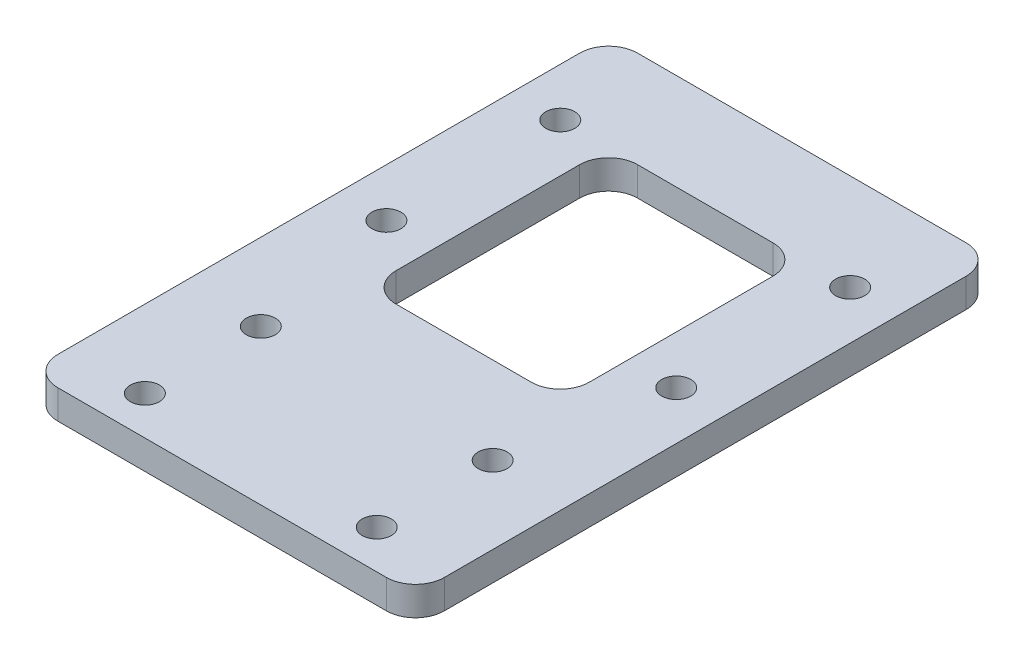
ISO-10303-21;
HEADER;
FILE_DESCRIPTION(('STEP AP214'),'2;1');
FILE_NAME('part.step','',(''),(''),'','','');
FILE_SCHEMA(('AUTOMOTIVE_DESIGN { 1 0 10303 214 1 1 1 1 }'));
ENDSEC;
DATA;
#1=APPLICATION_CONTEXT('core data for automotive mechanical design processes');
#2=APPLICATION_PROTOCOL_DEFINITION('international standard','automotive_design',2000,#1);
#3=PRODUCT_CONTEXT('',#1,'mechanical');
#4=PRODUCT('Part','Part','',(#3));
#5=PRODUCT_RELATED_PRODUCT_CATEGORY('part','',(#4));
#6=PRODUCT_DEFINITION_FORMATION('','',#4);
#7=PRODUCT_DEFINITION_CONTEXT('part definition',#1,'design');
#8=PRODUCT_DEFINITION('design','',#6,#7);
#9=PRODUCT_DEFINITION_SHAPE('','',#8);
#10=(LENGTH_UNIT() NAMED_UNIT(*) SI_UNIT(.MILLI.,.METRE.));
#11=(NAMED_UNIT(*) PLANE_ANGLE_UNIT() SI_UNIT($,.RADIAN.));
#12=(NAMED_UNIT(*) SI_UNIT($,.STERADIAN.) SOLID_ANGLE_UNIT());
#13=UNCERTAINTY_MEASURE_WITH_UNIT(LENGTH_MEASURE(1.E-05),#10,'distance_accuracy_value','');
#14=(GEOMETRIC_REPRESENTATION_CONTEXT(3) GLOBAL_UNCERTAINTY_ASSIGNED_CONTEXT((#13)) GLOBAL_UNIT_ASSIGNED_CONTEXT((#10,
#11,#12)) REPRESENTATION_CONTEXT('',''));
#15=CARTESIAN_POINT('',(0.,0.,0.));
#16=DIRECTION('',(0.,0.,1.));
#17=DIRECTION('',(1.,0.,0.));
#18=AXIS2_PLACEMENT_3D('',#15,#16,#17);
#19=CARTESIAN_POINT('',(0.,3.,0.));
#20=DIRECTION('',(0.,1.,0.));
#21=DIRECTION('',(0.,0.,1.));
#22=AXIS2_PLACEMENT_3D('',#19,#20,#21);
#23=PLANE('',#22);
#24=DIRECTION('',(0.,0.,1.));
#25=VECTOR('',#24,1.);
#26=CARTESIAN_POINT('',(-7.90203485427149,3.,-20.6326086507472));
#27=LINE('',#26,#25);
#28=CARTESIAN_POINT('',(-7.90203485427149,3.,-17.6326086507472));
#29=VERTEX_POINT('',#28);
#30=CARTESIAN_POINT('',(-7.90203485427149,3.,1.36739134925279));
#31=VERTEX_POINT('',#30);
#32=EDGE_CURVE('E254',#29,#31,#27,.T.);
#33=ORIENTED_EDGE('',*,*,#32,.F.);
#34=CARTESIAN_POINT('',(-4.90203485427149,3.,-17.6326086507472));
#35=DIRECTION('',(0.,1.,0.));
#36=DIRECTION('',(0.,0.,1.));
#37=AXIS2_PLACEMENT_3D('',#34,#35,#36);
#38=CIRCLE('',#37,3.);
#39=CARTESIAN_POINT('',(-4.90203485427149,3.,-20.6326086507472));
#40=VERTEX_POINT('',#39);
#41=EDGE_CURVE('E43',#29,#40,#38,.F.);
#42=ORIENTED_EDGE('',*,*,#41,.T.);
#43=DIRECTION('',(-1.,0.,0.));
#44=VECTOR('',#43,1.);
#45=CARTESIAN_POINT('',(-7.90203485427149,3.,-20.6326086507472));
#46=LINE('',#45,#44);
#47=CARTESIAN_POINT('',(9.09796514572851,3.,-20.6326086507472));
#48=VERTEX_POINT('',#47);
#49=EDGE_CURVE('E252',#48,#40,#46,.T.);
#50=ORIENTED_EDGE('',*,*,#49,.F.);
#51=CARTESIAN_POINT('',(9.09796514572851,3.,-17.6326086507472));
#52=DIRECTION('',(0.,1.,0.));
#53=DIRECTION('',(0.,0.,1.));
#54=AXIS2_PLACEMENT_3D('',#51,#52,#53);
#55=CIRCLE('',#54,3.);
#56=CARTESIAN_POINT('',(12.0979651457285,3.,-17.6326086507472));
#57=VERTEX_POINT('',#56);
#58=EDGE_CURVE('E246',#48,#57,#55,.F.);
#59=ORIENTED_EDGE('',*,*,#58,.T.);
#60=DIRECTION('',(0.,0.,-1.));
#61=VECTOR('',#60,1.);
#62=CARTESIAN_POINT('',(12.0979651457285,3.,-20.6326086507472));
#63=LINE('',#62,#61);
#64=CARTESIAN_POINT('',(12.0979651457285,3.,1.36739134925279));
#65=VERTEX_POINT('',#64);
#66=EDGE_CURVE('E260',#65,#57,#63,.T.);
#67=ORIENTED_EDGE('',*,*,#66,.F.);
#68=CARTESIAN_POINT('',(9.09796514572851,3.,1.36739134925279));
#69=DIRECTION('',(0.,1.,0.));
#70=DIRECTION('',(0.,0.,1.));
#71=AXIS2_PLACEMENT_3D('',#68,#69,#70);
#72=CIRCLE('',#71,3.);
#73=CARTESIAN_POINT('',(9.09796514572851,3.,4.36739134925279));
#74=VERTEX_POINT('',#73);
#75=EDGE_CURVE('E242',#65,#74,#72,.F.);
#76=ORIENTED_EDGE('',*,*,#75,.T.);
#77=DIRECTION('',(1.,0.,0.));
#78=VECTOR('',#77,1.);
#79=CARTESIAN_POINT('',(-7.90203485427149,3.,4.36739134925279));
#80=LINE('',#79,#78);
#81=CARTESIAN_POINT('',(-4.90203485427149,3.,4.36739134925279));
#82=VERTEX_POINT('',#81);
#83=EDGE_CURVE('E280',#82,#74,#80,.T.);
#84=ORIENTED_EDGE('',*,*,#83,.F.);
#85=CARTESIAN_POINT('',(-4.90203485427149,3.,1.36739134925279));
#86=DIRECTION('',(0.,1.,0.));
#87=DIRECTION('',(0.,0.,1.));
#88=AXIS2_PLACEMENT_3D('',#85,#86,#87);
#89=CIRCLE('',#88,3.);
#90=EDGE_CURVE('E238',#82,#31,#89,.F.);
#91=ORIENTED_EDGE('',*,*,#90,.T.);
#92=EDGE_LOOP('',(#33,#42,#50,#59,#67,#76,#84,#91));
#93=FACE_BOUND('',#92,.T.);
#94=CARTESIAN_POINT('',(17.0979651457285,3.,-20.6326086507472));
#95=DIRECTION('',(0.,1.,0.));
#96=DIRECTION('',(0.,0.,1.));
#97=AXIS2_PLACEMENT_3D('',#94,#95,#96);
#98=CIRCLE('',#97,1.5);
#99=CARTESIAN_POINT('',(17.0979651457285,3.,-19.1326086507472));
#100=VERTEX_POINT('',#99);
#101=EDGE_CURVE('E291',#100,#100,#98,.T.);
#102=ORIENTED_EDGE('',*,*,#101,.F.);
#103=EDGE_LOOP('',(#102));
#104=FACE_BOUND('',#103,.T.);
#105=CARTESIAN_POINT('',(17.0979651457285,3.,-2.63260865074721));
#106=DIRECTION('',(0.,1.,0.));
#107=DIRECTION('',(0.,0.,1.));
#108=AXIS2_PLACEMENT_3D('',#105,#106,#107);
#109=CIRCLE('',#108,1.5);
#110=CARTESIAN_POINT('',(17.0979651457285,3.,-1.13260865074721));
#111=VERTEX_POINT('',#110);
#112=EDGE_CURVE('E303',#111,#111,#109,.T.);
#113=ORIENTED_EDGE('',*,*,#112,.F.);
#114=EDGE_LOOP('',(#113));
#115=FACE_BOUND('',#114,.T.);
#116=CARTESIAN_POINT('',(14.0979651457285,3.,13.3673913492528));
#117=DIRECTION('',(0.,1.,0.));
#118=DIRECTION('',(0.,0.,1.));
#119=AXIS2_PLACEMENT_3D('',#116,#117,#118);
#120=CIRCLE('',#119,1.50000000000002);
#121=CARTESIAN_POINT('',(14.0979651457285,3.,14.8673913492528));
#122=VERTEX_POINT('',#121);
#123=EDGE_CURVE('E315',#122,#122,#120,.T.);
#124=ORIENTED_EDGE('',*,*,#123,.F.);
#125=EDGE_LOOP('',(#124));
#126=FACE_BOUND('',#125,.T.);
#127=CARTESIAN_POINT('',(14.0979651457285,3.,25.3673913492528));
#128=DIRECTION('',(0.,1.,0.));
#129=DIRECTION('',(0.,0.,1.));
#130=AXIS2_PLACEMENT_3D('',#127,#128,#129);
#131=CIRCLE('',#130,1.50000000000002);
#132=CARTESIAN_POINT('',(14.0979651457285,3.,26.8673913492528));
#133=VERTEX_POINT('',#132);
#134=EDGE_CURVE('E177',#133,#133,#131,.T.);
#135=ORIENTED_EDGE('',*,*,#134,.F.);
#136=EDGE_LOOP('',(#135));
#137=FACE_BOUND('',#136,.T.);
#138=DIRECTION('',(-1.,0.,0.));
#139=VECTOR('',#138,1.);
#140=CARTESIAN_POINT('',(22.0979651457285,3.,-30.6326086507472));
#141=LINE('',#140,#139);
#142=CARTESIAN_POINT('',(19.0979651457285,3.,-30.6326086507472));
#143=VERTEX_POINT('',#142);
#144=CARTESIAN_POINT('',(-14.9020348542715,3.,-30.6326086507472));
#145=VERTEX_POINT('',#144);
#146=EDGE_CURVE('E186',#143,#145,#141,.T.);
#147=ORIENTED_EDGE('',*,*,#146,.T.);
#148=CARTESIAN_POINT('',(-14.9020348542715,3.,-27.6326086507472));
#149=DIRECTION('',(0.,1.,0.));
#150=DIRECTION('',(0.,0.,1.));
#151=AXIS2_PLACEMENT_3D('',#148,#149,#150);
#152=CIRCLE('',#151,3.);
#153=CARTESIAN_POINT('',(-17.9020348542715,3.,-27.6326086507472));
#154=VERTEX_POINT('',#153);
#155=EDGE_CURVE('E207',#145,#154,#152,.T.);
#156=ORIENTED_EDGE('',*,*,#155,.T.);
#157=DIRECTION('',(0.,0.,1.));
#158=VECTOR('',#157,1.);
#159=CARTESIAN_POINT('',(-17.9020348542715,3.,-30.6326086507472));
#160=LINE('',#159,#158);
#161=CARTESIAN_POINT('',(-17.9020348542715,3.,26.3673913492528));
#162=VERTEX_POINT('',#161);
#163=EDGE_CURVE('E169',#154,#162,#160,.T.);
#164=ORIENTED_EDGE('',*,*,#163,.T.);
#165=CARTESIAN_POINT('',(-14.9020348542715,3.,26.3673913492528));
#166=DIRECTION('',(0.,1.,0.));
#167=DIRECTION('',(0.,0.,1.));
#168=AXIS2_PLACEMENT_3D('',#165,#166,#167);
#169=CIRCLE('',#168,3.);
#170=CARTESIAN_POINT('',(-14.9020348542715,3.,29.3673913492528));
#171=VERTEX_POINT('',#170);
#172=EDGE_CURVE('E201',#162,#171,#169,.T.);
#173=ORIENTED_EDGE('',*,*,#172,.T.);
#174=DIRECTION('',(1.,0.,0.));
#175=VECTOR('',#174,1.);
#176=CARTESIAN_POINT('',(-17.9020348542715,3.,29.3673913492528));
#177=LINE('',#176,#175);
#178=CARTESIAN_POINT('',(19.0979651457285,3.,29.3673913492528));
#179=VERTEX_POINT('',#178);
#180=EDGE_CURVE('E329',#171,#179,#177,.T.);
#181=ORIENTED_EDGE('',*,*,#180,.T.);
#182=CARTESIAN_POINT('',(19.0979651457285,3.,26.3673913492528));
#183=DIRECTION('',(0.,1.,0.));
#184=DIRECTION('',(0.,0.,1.));
#185=AXIS2_PLACEMENT_3D('',#182,#183,#184);
#186=CIRCLE('',#185,3.);
#187=CARTESIAN_POINT('',(22.0979651457285,3.,26.3673913492528));
#188=VERTEX_POINT('',#187);
#189=EDGE_CURVE('E203',#179,#188,#186,.T.);
#190=ORIENTED_EDGE('',*,*,#189,.T.);
#191=DIRECTION('',(0.,0.,-1.));
#192=VECTOR('',#191,1.);
#193=CARTESIAN_POINT('',(22.0979651457285,3.,-30.6326086507472));
#194=LINE('',#193,#192);
#195=CARTESIAN_POINT('',(22.0979651457285,3.,-27.6326086507472));
#196=VERTEX_POINT('',#195);
#197=EDGE_CURVE('E331',#188,#196,#194,.T.);
#198=ORIENTED_EDGE('',*,*,#197,.T.);
#199=CARTESIAN_POINT('',(19.0979651457285,3.,-27.6326086507472));
#200=DIRECTION('',(0.,1.,0.));
#201=DIRECTION('',(0.,0.,1.));
#202=AXIS2_PLACEMENT_3D('',#199,#200,#201);
#203=CIRCLE('',#202,3.);
#204=EDGE_CURVE('E205',#196,#143,#203,.T.);
#205=ORIENTED_EDGE('',*,*,#204,.T.);
#206=EDGE_LOOP('',(#147,#156,#164,#173,#181,#190,#198,#205));
#207=FACE_BOUND('',#206,.T.);
#208=CARTESIAN_POINT('',(-9.90203485427151,3.,25.3673913492528));
#209=DIRECTION('',(0.,1.,0.));
#210=DIRECTION('',(0.,0.,1.));
#211=AXIS2_PLACEMENT_3D('',#208,#209,#210);
#212=CIRCLE('',#211,1.5);
#213=CARTESIAN_POINT('',(-9.90203485427151,3.,26.8673913492528));
#214=VERTEX_POINT('',#213);
#215=EDGE_CURVE('E321',#214,#214,#212,.T.);
#216=ORIENTED_EDGE('',*,*,#215,.F.);
#217=EDGE_LOOP('',(#216));
#218=FACE_BOUND('',#217,.T.);
#219=CARTESIAN_POINT('',(-9.90203485427151,3.,13.3673913492528));
#220=DIRECTION('',(0.,1.,0.));
#221=DIRECTION('',(0.,0.,1.));
#222=AXIS2_PLACEMENT_3D('',#219,#220,#221);
#223=CIRCLE('',#222,1.5);
#224=CARTESIAN_POINT('',(-9.90203485427151,3.,14.8673913492528));
#225=VERTEX_POINT('',#224);
#226=EDGE_CURVE('E309',#225,#225,#223,.T.);
#227=ORIENTED_EDGE('',*,*,#226,.F.);
#228=EDGE_LOOP('',(#227));
#229=FACE_BOUND('',#228,.T.);
#230=CARTESIAN_POINT('',(-12.9020348542715,3.,-2.63260865074721));
#231=DIRECTION('',(0.,1.,0.));
#232=DIRECTION('',(0.,0.,1.));
#233=AXIS2_PLACEMENT_3D('',#230,#231,#232);
#234=CIRCLE('',#233,1.5);
#235=CARTESIAN_POINT('',(-12.9020348542715,3.,-1.13260865074721));
#236=VERTEX_POINT('',#235);
#237=EDGE_CURVE('E297',#236,#236,#234,.T.);
#238=ORIENTED_EDGE('',*,*,#237,.F.);
#239=EDGE_LOOP('',(#238));
#240=FACE_BOUND('',#239,.T.);
#241=CARTESIAN_POINT('',(-12.9020348542715,3.,-20.6326086507472));
#242=DIRECTION('',(0.,1.,0.));
#243=DIRECTION('',(0.,0.,1.));
#244=AXIS2_PLACEMENT_3D('',#241,#242,#243);
#245=CIRCLE('',#244,1.5);
#246=CARTESIAN_POINT('',(-12.9020348542715,3.,-19.1326086507472));
#247=VERTEX_POINT('',#246);
#248=EDGE_CURVE('E285',#247,#247,#245,.T.);
#249=ORIENTED_EDGE('',*,*,#248,.F.);
#250=EDGE_LOOP('',(#249));
#251=FACE_BOUND('',#250,.T.);
#252=ADVANCED_FACE('F35',(#93,#104,#115,#126,#137,#207,#218,#229,#240,#251),#23,.T.);
#253=CARTESIAN_POINT('',(0.,0.,0.));
#254=DIRECTION('',(0.,1.,0.));
#255=DIRECTION('',(0.,0.,1.));
#256=AXIS2_PLACEMENT_3D('',#253,#254,#255);
#257=PLANE('',#256);
#258=DIRECTION('',(0.,0.,-1.));
#259=VECTOR('',#258,1.);
#260=CARTESIAN_POINT('',(12.0979651457285,0.,-20.6326086507472));
#261=LINE('',#260,#259);
#262=CARTESIAN_POINT('',(12.0979651457285,0.,1.36739134925279));
#263=VERTEX_POINT('',#262);
#264=CARTESIAN_POINT('',(12.0979651457285,0.,-17.6326086507472));
#265=VERTEX_POINT('',#264);
#266=EDGE_CURVE('E273',#263,#265,#261,.T.);
#267=ORIENTED_EDGE('',*,*,#266,.T.);
#268=CARTESIAN_POINT('',(9.09796514572851,0.,-17.6326086507472));
#269=DIRECTION('',(0.,1.,0.));
#270=DIRECTION('',(0.,0.,1.));
#271=AXIS2_PLACEMENT_3D('',#268,#269,#270);
#272=CIRCLE('',#271,3.);
#273=CARTESIAN_POINT('',(9.09796514572851,0.,-20.6326086507472));
#274=VERTEX_POINT('',#273);
#275=EDGE_CURVE('E57',#265,#274,#272,.T.);
#276=ORIENTED_EDGE('',*,*,#275,.T.);
#277=DIRECTION('',(-1.,0.,0.));
#278=VECTOR('',#277,1.);
#279=CARTESIAN_POINT('',(-7.90203485427149,0.,-20.6326086507472));
#280=LINE('',#279,#278);
#281=CARTESIAN_POINT('',(-4.90203485427149,0.,-20.6326086507472));
#282=VERTEX_POINT('',#281);
#283=EDGE_CURVE('E266',#274,#282,#280,.T.);
#284=ORIENTED_EDGE('',*,*,#283,.T.);
#285=CARTESIAN_POINT('',(-4.90203485427149,0.,-17.6326086507472));
#286=DIRECTION('',(0.,1.,0.));
#287=DIRECTION('',(0.,0.,1.));
#288=AXIS2_PLACEMENT_3D('',#285,#286,#287);
#289=CIRCLE('',#288,3.);
#290=CARTESIAN_POINT('',(-7.90203485427149,0.,-17.6326086507472));
#291=VERTEX_POINT('',#290);
#292=EDGE_CURVE('E11',#282,#291,#289,.T.);
#293=ORIENTED_EDGE('',*,*,#292,.T.);
#294=DIRECTION('',(0.,0.,1.));
#295=VECTOR('',#294,1.);
#296=CARTESIAN_POINT('',(-7.90203485427149,0.,-20.6326086507472));
#297=LINE('',#296,#295);
#298=CARTESIAN_POINT('',(-7.90203485427149,0.,1.36739134925279));
#299=VERTEX_POINT('',#298);
#300=EDGE_CURVE('E259',#291,#299,#297,.T.);
#301=ORIENTED_EDGE('',*,*,#300,.T.);
#302=CARTESIAN_POINT('',(-4.90203485427149,0.,1.36739134925279));
#303=DIRECTION('',(0.,1.,0.));
#304=DIRECTION('',(0.,0.,1.));
#305=AXIS2_PLACEMENT_3D('',#302,#303,#304);
#306=CIRCLE('',#305,3.);
#307=CARTESIAN_POINT('',(-4.90203485427149,0.,4.36739134925279));
#308=VERTEX_POINT('',#307);
#309=EDGE_CURVE('E240',#299,#308,#306,.T.);
#310=ORIENTED_EDGE('',*,*,#309,.T.);
#311=DIRECTION('',(1.,0.,0.));
#312=VECTOR('',#311,1.);
#313=CARTESIAN_POINT('',(-7.90203485427149,0.,4.36739134925279));
#314=LINE('',#313,#312);
#315=CARTESIAN_POINT('',(9.09796514572851,0.,4.36739134925279));
#316=VERTEX_POINT('',#315);
#317=EDGE_CURVE('E270',#308,#316,#314,.T.);
#318=ORIENTED_EDGE('',*,*,#317,.T.);
#319=CARTESIAN_POINT('',(9.09796514572851,0.,1.36739134925279));
#320=DIRECTION('',(0.,1.,0.));
#321=DIRECTION('',(0.,0.,1.));
#322=AXIS2_PLACEMENT_3D('',#319,#320,#321);
#323=CIRCLE('',#322,3.);
#324=EDGE_CURVE('E244',#316,#263,#323,.T.);
#325=ORIENTED_EDGE('',*,*,#324,.T.);
#326=EDGE_LOOP('',(#267,#276,#284,#293,#301,#310,#318,#325));
#327=FACE_BOUND('',#326,.T.);
#328=DIRECTION('',(0.,0.,1.));
#329=VECTOR('',#328,1.);
#330=CARTESIAN_POINT('',(-17.9020348542715,0.,-30.6326086507472));
#331=LINE('',#330,#329);
#332=CARTESIAN_POINT('',(-17.9020348542715,0.,-27.6326086507472));
#333=VERTEX_POINT('',#332);
#334=CARTESIAN_POINT('',(-17.9020348542715,0.,26.3673913492528));
#335=VERTEX_POINT('',#334);
#336=EDGE_CURVE('E166',#333,#335,#331,.T.);
#337=ORIENTED_EDGE('',*,*,#336,.F.);
#338=CARTESIAN_POINT('',(-14.9020348542715,0.,-27.6326086507472));
#339=DIRECTION('',(0.,1.,0.));
#340=DIRECTION('',(0.,0.,1.));
#341=AXIS2_PLACEMENT_3D('',#338,#339,#340);
#342=CIRCLE('',#341,3.);
#343=CARTESIAN_POINT('',(-14.9020348542715,0.,-30.6326086507472));
#344=VERTEX_POINT('',#343);
#345=EDGE_CURVE('E149',#333,#344,#342,.F.);
#346=ORIENTED_EDGE('',*,*,#345,.T.);
#347=DIRECTION('',(-1.,0.,0.));
#348=VECTOR('',#347,1.);
#349=CARTESIAN_POINT('',(22.0979651457285,0.,-30.6326086507472));
#350=LINE('',#349,#348);
#351=CARTESIAN_POINT('',(19.0979651457285,0.,-30.6326086507472));
#352=VERTEX_POINT('',#351);
#353=EDGE_CURVE('E191',#352,#344,#350,.T.);
#354=ORIENTED_EDGE('',*,*,#353,.F.);
#355=CARTESIAN_POINT('',(19.0979651457285,0.,-27.6326086507472));
#356=DIRECTION('',(0.,1.,0.));
#357=DIRECTION('',(0.,0.,1.));
#358=AXIS2_PLACEMENT_3D('',#355,#356,#357);
#359=CIRCLE('',#358,3.);
#360=CARTESIAN_POINT('',(22.0979651457285,0.,-27.6326086507472));
#361=VERTEX_POINT('',#360);
#362=EDGE_CURVE('E160',#352,#361,#359,.F.);
#363=ORIENTED_EDGE('',*,*,#362,.T.);
#364=DIRECTION('',(0.,0.,-1.));
#365=VECTOR('',#364,1.);
#366=CARTESIAN_POINT('',(22.0979651457285,0.,-30.6326086507472));
#367=LINE('',#366,#365);
#368=CARTESIAN_POINT('',(22.0979651457285,0.,26.3673913492528));
#369=VERTEX_POINT('',#368);
#370=EDGE_CURVE('E180',#369,#361,#367,.T.);
#371=ORIENTED_EDGE('',*,*,#370,.F.);
#372=CARTESIAN_POINT('',(19.0979651457285,0.,26.3673913492528));
#373=DIRECTION('',(0.,1.,0.));
#374=DIRECTION('',(0.,0.,1.));
#375=AXIS2_PLACEMENT_3D('',#372,#373,#374);
#376=CIRCLE('',#375,3.);
#377=CARTESIAN_POINT('',(19.0979651457285,0.,29.3673913492528));
#378=VERTEX_POINT('',#377);
#379=EDGE_CURVE('E195',#369,#378,#376,.F.);
#380=ORIENTED_EDGE('',*,*,#379,.T.);
#381=DIRECTION('',(1.,0.,0.));
#382=VECTOR('',#381,1.);
#383=CARTESIAN_POINT('',(-17.9020348542715,0.,29.3673913492528));
#384=LINE('',#383,#382);
#385=CARTESIAN_POINT('',(-14.9020348542715,0.,29.3673913492528));
#386=VERTEX_POINT('',#385);
#387=EDGE_CURVE('E176',#386,#378,#384,.T.);
#388=ORIENTED_EDGE('',*,*,#387,.F.);
#389=CARTESIAN_POINT('',(-14.9020348542715,0.,26.3673913492528));
#390=DIRECTION('',(0.,1.,0.));
#391=DIRECTION('',(0.,0.,1.));
#392=AXIS2_PLACEMENT_3D('',#389,#390,#391);
#393=CIRCLE('',#392,3.);
#394=EDGE_CURVE('E170',#386,#335,#393,.F.);
#395=ORIENTED_EDGE('',*,*,#394,.T.);
#396=EDGE_LOOP('',(#337,#346,#354,#363,#371,#380,#388,#395));
#397=FACE_BOUND('',#396,.T.);
#398=CARTESIAN_POINT('',(14.0979651457285,0.,25.3673913492528));
#399=DIRECTION('',(0.,1.,0.));
#400=DIRECTION('',(0.,0.,1.));
#401=AXIS2_PLACEMENT_3D('',#398,#399,#400);
#402=CIRCLE('',#401,1.50000000000002);
#403=CARTESIAN_POINT('',(14.0979651457285,0.,26.8673913492528));
#404=VERTEX_POINT('',#403);
#405=EDGE_CURVE('E183',#404,#404,#402,.T.);
#406=ORIENTED_EDGE('',*,*,#405,.T.);
#407=EDGE_LOOP('',(#406));
#408=FACE_BOUND('',#407,.T.);
#409=CARTESIAN_POINT('',(-9.90203485427151,0.,25.3673913492528));
#410=DIRECTION('',(0.,1.,0.));
#411=DIRECTION('',(0.,0.,1.));
#412=AXIS2_PLACEMENT_3D('',#409,#410,#411);
#413=CIRCLE('',#412,1.5);
#414=CARTESIAN_POINT('',(-9.90203485427151,0.,26.8673913492528));
#415=VERTEX_POINT('',#414);
#416=EDGE_CURVE('E318',#415,#415,#413,.T.);
#417=ORIENTED_EDGE('',*,*,#416,.T.);
#418=EDGE_LOOP('',(#417));
#419=FACE_BOUND('',#418,.T.);
#420=CARTESIAN_POINT('',(14.0979651457285,0.,13.3673913492528));
#421=DIRECTION('',(0.,1.,0.));
#422=DIRECTION('',(0.,0.,1.));
#423=AXIS2_PLACEMENT_3D('',#420,#421,#422);
#424=CIRCLE('',#423,1.50000000000002);
#425=CARTESIAN_POINT('',(14.0979651457285,0.,14.8673913492528));
#426=VERTEX_POINT('',#425);
#427=EDGE_CURVE('E312',#426,#426,#424,.T.);
#428=ORIENTED_EDGE('',*,*,#427,.T.);
#429=EDGE_LOOP('',(#428));
#430=FACE_BOUND('',#429,.T.);
#431=CARTESIAN_POINT('',(-9.90203485427151,0.,13.3673913492528));
#432=DIRECTION('',(0.,1.,0.));
#433=DIRECTION('',(0.,0.,1.));
#434=AXIS2_PLACEMENT_3D('',#431,#432,#433);
#435=CIRCLE('',#434,1.5);
#436=CARTESIAN_POINT('',(-9.90203485427151,0.,14.8673913492528));
#437=VERTEX_POINT('',#436);
#438=EDGE_CURVE('E306',#437,#437,#435,.T.);
#439=ORIENTED_EDGE('',*,*,#438,.T.);
#440=EDGE_LOOP('',(#439));
#441=FACE_BOUND('',#440,.T.);
#442=CARTESIAN_POINT('',(17.0979651457285,0.,-2.63260865074721));
#443=DIRECTION('',(0.,1.,0.));
#444=DIRECTION('',(0.,0.,1.));
#445=AXIS2_PLACEMENT_3D('',#442,#443,#444);
#446=CIRCLE('',#445,1.5);
#447=CARTESIAN_POINT('',(17.0979651457285,0.,-1.13260865074721));
#448=VERTEX_POINT('',#447);
#449=EDGE_CURVE('E300',#448,#448,#446,.T.);
#450=ORIENTED_EDGE('',*,*,#449,.T.);
#451=EDGE_LOOP('',(#450));
#452=FACE_BOUND('',#451,.T.);
#453=CARTESIAN_POINT('',(-12.9020348542715,0.,-2.63260865074721));
#454=DIRECTION('',(0.,1.,0.));
#455=DIRECTION('',(0.,0.,1.));
#456=AXIS2_PLACEMENT_3D('',#453,#454,#455);
#457=CIRCLE('',#456,1.5);
#458=CARTESIAN_POINT('',(-12.9020348542715,0.,-1.13260865074721));
#459=VERTEX_POINT('',#458);
#460=EDGE_CURVE('E294',#459,#459,#457,.T.);
#461=ORIENTED_EDGE('',*,*,#460,.T.);
#462=EDGE_LOOP('',(#461));
#463=FACE_BOUND('',#462,.T.);
#464=CARTESIAN_POINT('',(17.0979651457285,0.,-20.6326086507472));
#465=DIRECTION('',(0.,1.,0.));
#466=DIRECTION('',(0.,0.,1.));
#467=AXIS2_PLACEMENT_3D('',#464,#465,#466);
#468=CIRCLE('',#467,1.5);
#469=CARTESIAN_POINT('',(17.0979651457285,0.,-19.1326086507472));
#470=VERTEX_POINT('',#469);
#471=EDGE_CURVE('E288',#470,#470,#468,.T.);
#472=ORIENTED_EDGE('',*,*,#471,.T.);
#473=EDGE_LOOP('',(#472));
#474=FACE_BOUND('',#473,.T.);
#475=CARTESIAN_POINT('',(-12.9020348542715,0.,-20.6326086507472));
#476=DIRECTION('',(0.,1.,0.));
#477=DIRECTION('',(0.,0.,1.));
#478=AXIS2_PLACEMENT_3D('',#475,#476,#477);
#479=CIRCLE('',#478,1.5);
#480=CARTESIAN_POINT('',(-12.9020348542715,0.,-19.1326086507472));
#481=VERTEX_POINT('',#480);
#482=EDGE_CURVE('E278',#481,#481,#479,.T.);
#483=ORIENTED_EDGE('',*,*,#482,.T.);
#484=EDGE_LOOP('',(#483));
#485=FACE_BOUND('',#484,.T.);
#486=ADVANCED_FACE('F173',(#327,#397,#408,#419,#430,#441,#452,#463,#474,#485),#257,.F.);
#487=CARTESIAN_POINT('',(-17.9020348542715,3.,-30.6326086507472));
#488=DIRECTION('',(1.,0.,0.));
#489=DIRECTION('',(0.,0.,-1.));
#490=AXIS2_PLACEMENT_3D('',#487,#488,#489);
#491=PLANE('',#490);
#492=ORIENTED_EDGE('',*,*,#163,.F.);
#493=DIRECTION('',(0.,-1.,0.));
#494=VECTOR('',#493,1.);
#495=CARTESIAN_POINT('',(-17.9020348542715,3.,-27.6326086507472));
#496=LINE('',#495,#494);
#497=EDGE_CURVE('E153',#154,#333,#496,.T.);
#498=ORIENTED_EDGE('',*,*,#497,.T.);
#499=ORIENTED_EDGE('',*,*,#336,.T.);
#500=DIRECTION('',(0.,-1.,0.));
#501=VECTOR('',#500,1.);
#502=CARTESIAN_POINT('',(-17.9020348542715,3.,26.3673913492528));
#503=LINE('',#502,#501);
#504=EDGE_CURVE('E171',#335,#162,#503,.F.);
#505=ORIENTED_EDGE('',*,*,#504,.T.);
#506=EDGE_LOOP('',(#492,#498,#499,#505));
#507=FACE_BOUND('',#506,.T.);
#508=ADVANCED_FACE('F165',(#507),#491,.F.);
#509=CARTESIAN_POINT('',(-17.9020348542715,3.,29.3673913492528));
#510=DIRECTION('',(0.,0.,-1.));
#511=DIRECTION('',(-1.,0.,0.));
#512=AXIS2_PLACEMENT_3D('',#509,#510,#511);
#513=PLANE('',#512);
#514=ORIENTED_EDGE('',*,*,#387,.T.);
#515=DIRECTION('',(0.,-1.,0.));
#516=VECTOR('',#515,1.);
#517=CARTESIAN_POINT('',(19.0979651457285,3.,29.3673913492528));
#518=LINE('',#517,#516);
#519=EDGE_CURVE('E217',#378,#179,#518,.F.);
#520=ORIENTED_EDGE('',*,*,#519,.T.);
#521=ORIENTED_EDGE('',*,*,#180,.F.);
#522=DIRECTION('',(0.,-1.,0.));
#523=VECTOR('',#522,1.);
#524=CARTESIAN_POINT('',(-14.9020348542715,3.,29.3673913492528));
#525=LINE('',#524,#523);
#526=EDGE_CURVE('E214',#171,#386,#525,.T.);
#527=ORIENTED_EDGE('',*,*,#526,.T.);
#528=EDGE_LOOP('',(#514,#520,#521,#527));
#529=FACE_BOUND('',#528,.T.);
#530=ADVANCED_FACE('F354',(#529),#513,.F.);
#531=CARTESIAN_POINT('',(22.0979651457285,3.,-30.6326086507472));
#532=DIRECTION('',(-1.,0.,0.));
#533=DIRECTION('',(0.,0.,1.));
#534=AXIS2_PLACEMENT_3D('',#531,#532,#533);
#535=PLANE('',#534);
#536=ORIENTED_EDGE('',*,*,#370,.T.);
#537=DIRECTION('',(0.,-1.,0.));
#538=VECTOR('',#537,1.);
#539=CARTESIAN_POINT('',(22.0979651457285,3.,-27.6326086507472));
#540=LINE('',#539,#538);
#541=EDGE_CURVE('E212',#361,#196,#540,.F.);
#542=ORIENTED_EDGE('',*,*,#541,.T.);
#543=ORIENTED_EDGE('',*,*,#197,.F.);
#544=DIRECTION('',(0.,-1.,0.));
#545=VECTOR('',#544,1.);
#546=CARTESIAN_POINT('',(22.0979651457285,3.,26.3673913492528));
#547=LINE('',#546,#545);
#548=EDGE_CURVE('E209',#188,#369,#547,.T.);
#549=ORIENTED_EDGE('',*,*,#548,.T.);
#550=EDGE_LOOP('',(#536,#542,#543,#549));
#551=FACE_BOUND('',#550,.T.);
#552=ADVANCED_FACE('F347',(#551),#535,.F.);
#553=CARTESIAN_POINT('',(22.0979651457285,3.,-30.6326086507472));
#554=DIRECTION('',(0.,0.,1.));
#555=DIRECTION('',(1.,0.,0.));
#556=AXIS2_PLACEMENT_3D('',#553,#554,#555);
#557=PLANE('',#556);
#558=ORIENTED_EDGE('',*,*,#353,.T.);
#559=DIRECTION('',(0.,-1.,0.));
#560=VECTOR('',#559,1.);
#561=CARTESIAN_POINT('',(-14.9020348542715,3.,-30.6326086507472));
#562=LINE('',#561,#560);
#563=EDGE_CURVE('E154',#344,#145,#562,.F.);
#564=ORIENTED_EDGE('',*,*,#563,.T.);
#565=ORIENTED_EDGE('',*,*,#146,.F.);
#566=DIRECTION('',(0.,-1.,0.));
#567=VECTOR('',#566,1.);
#568=CARTESIAN_POINT('',(19.0979651457285,3.,-30.6326086507472));
#569=LINE('',#568,#567);
#570=EDGE_CURVE('E159',#143,#352,#569,.T.);
#571=ORIENTED_EDGE('',*,*,#570,.T.);
#572=EDGE_LOOP('',(#558,#564,#565,#571));
#573=FACE_BOUND('',#572,.T.);
#574=ADVANCED_FACE('F341',(#573),#557,.F.);
#575=CARTESIAN_POINT('',(14.0979651457285,3.,25.3673913492528));
#576=DIRECTION('',(0.,-1.,0.));
#577=DIRECTION('',(0.,0.,-1.));
#578=AXIS2_PLACEMENT_3D('',#575,#576,#577);
#579=CYLINDRICAL_SURFACE('',#578,1.50000000000002);
#580=ORIENTED_EDGE('',*,*,#134,.T.);
#581=EDGE_LOOP('',(#580));
#582=FACE_BOUND('',#581,.T.);
#583=ORIENTED_EDGE('',*,*,#405,.F.);
#584=EDGE_LOOP('',(#583));
#585=FACE_BOUND('',#584,.T.);
#586=ADVANCED_FACE('F376',(#582,#585),#579,.F.);
#587=CARTESIAN_POINT('',(-9.90203485427151,3.,25.3673913492528));
#588=DIRECTION('',(0.,-1.,0.));
#589=DIRECTION('',(0.,0.,-1.));
#590=AXIS2_PLACEMENT_3D('',#587,#588,#589);
#591=CYLINDRICAL_SURFACE('',#590,1.5);
#592=ORIENTED_EDGE('',*,*,#215,.T.);
#593=EDGE_LOOP('',(#592));
#594=FACE_BOUND('',#593,.T.);
#595=ORIENTED_EDGE('',*,*,#416,.F.);
#596=EDGE_LOOP('',(#595));
#597=FACE_BOUND('',#596,.T.);
#598=ADVANCED_FACE('F507',(#594,#597),#591,.F.);
#599=CARTESIAN_POINT('',(14.0979651457285,3.,13.3673913492528));
#600=DIRECTION('',(0.,-1.,0.));
#601=DIRECTION('',(0.,0.,-1.));
#602=AXIS2_PLACEMENT_3D('',#599,#600,#601);
#603=CYLINDRICAL_SURFACE('',#602,1.50000000000002);
#604=ORIENTED_EDGE('',*,*,#123,.T.);
#605=EDGE_LOOP('',(#604));
#606=FACE_BOUND('',#605,.T.);
#607=ORIENTED_EDGE('',*,*,#427,.F.);
#608=EDGE_LOOP('',(#607));
#609=FACE_BOUND('',#608,.T.);
#610=ADVANCED_FACE('F504',(#606,#609),#603,.F.);
#611=CARTESIAN_POINT('',(-9.90203485427151,3.,13.3673913492528));
#612=DIRECTION('',(0.,-1.,0.));
#613=DIRECTION('',(0.,0.,-1.));
#614=AXIS2_PLACEMENT_3D('',#611,#612,#613);
#615=CYLINDRICAL_SURFACE('',#614,1.5);
#616=ORIENTED_EDGE('',*,*,#226,.T.);
#617=EDGE_LOOP('',(#616));
#618=FACE_BOUND('',#617,.T.);
#619=ORIENTED_EDGE('',*,*,#438,.F.);
#620=EDGE_LOOP('',(#619));
#621=FACE_BOUND('',#620,.T.);
#622=ADVANCED_FACE('F500',(#618,#621),#615,.F.);
#623=CARTESIAN_POINT('',(17.0979651457285,3.,-2.63260865074721));
#624=DIRECTION('',(0.,-1.,0.));
#625=DIRECTION('',(0.,0.,-1.));
#626=AXIS2_PLACEMENT_3D('',#623,#624,#625);
#627=CYLINDRICAL_SURFACE('',#626,1.5);
#628=ORIENTED_EDGE('',*,*,#112,.T.);
#629=EDGE_LOOP('',(#628));
#630=FACE_BOUND('',#629,.T.);
#631=ORIENTED_EDGE('',*,*,#449,.F.);
#632=EDGE_LOOP('',(#631));
#633=FACE_BOUND('',#632,.T.);
#634=ADVANCED_FACE('F496',(#630,#633),#627,.F.);
#635=CARTESIAN_POINT('',(-12.9020348542715,3.,-2.63260865074721));
#636=DIRECTION('',(0.,-1.,0.));
#637=DIRECTION('',(0.,0.,-1.));
#638=AXIS2_PLACEMENT_3D('',#635,#636,#637);
#639=CYLINDRICAL_SURFACE('',#638,1.5);
#640=ORIENTED_EDGE('',*,*,#237,.T.);
#641=EDGE_LOOP('',(#640));
#642=FACE_BOUND('',#641,.T.);
#643=ORIENTED_EDGE('',*,*,#460,.F.);
#644=EDGE_LOOP('',(#643));
#645=FACE_BOUND('',#644,.T.);
#646=ADVANCED_FACE('F492',(#642,#645),#639,.F.);
#647=CARTESIAN_POINT('',(17.0979651457285,3.,-20.6326086507472));
#648=DIRECTION('',(0.,-1.,0.));
#649=DIRECTION('',(0.,0.,-1.));
#650=AXIS2_PLACEMENT_3D('',#647,#648,#649);
#651=CYLINDRICAL_SURFACE('',#650,1.5);
#652=ORIENTED_EDGE('',*,*,#101,.T.);
#653=EDGE_LOOP('',(#652));
#654=FACE_BOUND('',#653,.T.);
#655=ORIENTED_EDGE('',*,*,#471,.F.);
#656=EDGE_LOOP('',(#655));
#657=FACE_BOUND('',#656,.T.);
#658=ADVANCED_FACE('F488',(#654,#657),#651,.F.);
#659=CARTESIAN_POINT('',(-12.9020348542715,3.,-20.6326086507472));
#660=DIRECTION('',(0.,-1.,0.));
#661=DIRECTION('',(0.,0.,-1.));
#662=AXIS2_PLACEMENT_3D('',#659,#660,#661);
#663=CYLINDRICAL_SURFACE('',#662,1.5);
#664=ORIENTED_EDGE('',*,*,#248,.T.);
#665=EDGE_LOOP('',(#664));
#666=FACE_BOUND('',#665,.T.);
#667=ORIENTED_EDGE('',*,*,#482,.F.);
#668=EDGE_LOOP('',(#667));
#669=FACE_BOUND('',#668,.T.);
#670=ADVANCED_FACE('F389',(#666,#669),#663,.F.);
#671=CARTESIAN_POINT('',(-14.9020348542715,3.,-27.6326086507472));
#672=DIRECTION('',(0.,-1.,0.));
#673=DIRECTION('',(0.,0.,-1.));
#674=AXIS2_PLACEMENT_3D('',#671,#672,#673);
#675=CYLINDRICAL_SURFACE('',#674,3.);
#676=ORIENTED_EDGE('',*,*,#155,.F.);
#677=ORIENTED_EDGE('',*,*,#563,.F.);
#678=ORIENTED_EDGE('',*,*,#345,.F.);
#679=ORIENTED_EDGE('',*,*,#497,.F.);
#680=EDGE_LOOP('',(#676,#677,#678,#679));
#681=FACE_BOUND('',#680,.T.);
#682=ADVANCED_FACE('F152',(#681),#675,.T.);
#683=CARTESIAN_POINT('',(19.0979651457285,3.,-27.6326086507472));
#684=DIRECTION('',(0.,-1.,0.));
#685=DIRECTION('',(0.,0.,-1.));
#686=AXIS2_PLACEMENT_3D('',#683,#684,#685);
#687=CYLINDRICAL_SURFACE('',#686,3.);
#688=ORIENTED_EDGE('',*,*,#204,.F.);
#689=ORIENTED_EDGE('',*,*,#541,.F.);
#690=ORIENTED_EDGE('',*,*,#362,.F.);
#691=ORIENTED_EDGE('',*,*,#570,.F.);
#692=EDGE_LOOP('',(#688,#689,#690,#691));
#693=FACE_BOUND('',#692,.T.);
#694=ADVANCED_FACE('F343',(#693),#687,.T.);
#695=CARTESIAN_POINT('',(19.0979651457285,3.,26.3673913492528));
#696=DIRECTION('',(0.,-1.,0.));
#697=DIRECTION('',(0.,0.,-1.));
#698=AXIS2_PLACEMENT_3D('',#695,#696,#697);
#699=CYLINDRICAL_SURFACE('',#698,3.);
#700=ORIENTED_EDGE('',*,*,#189,.F.);
#701=ORIENTED_EDGE('',*,*,#519,.F.);
#702=ORIENTED_EDGE('',*,*,#379,.F.);
#703=ORIENTED_EDGE('',*,*,#548,.F.);
#704=EDGE_LOOP('',(#700,#701,#702,#703));
#705=FACE_BOUND('',#704,.T.);
#706=ADVANCED_FACE('F351',(#705),#699,.T.);
#707=CARTESIAN_POINT('',(-14.9020348542715,3.,26.3673913492528));
#708=DIRECTION('',(0.,-1.,0.));
#709=DIRECTION('',(0.,0.,-1.));
#710=AXIS2_PLACEMENT_3D('',#707,#708,#709);
#711=CYLINDRICAL_SURFACE('',#710,3.);
#712=ORIENTED_EDGE('',*,*,#172,.F.);
#713=ORIENTED_EDGE('',*,*,#504,.F.);
#714=ORIENTED_EDGE('',*,*,#394,.F.);
#715=ORIENTED_EDGE('',*,*,#526,.F.);
#716=EDGE_LOOP('',(#712,#713,#714,#715));
#717=FACE_BOUND('',#716,.T.);
#718=ADVANCED_FACE('F359',(#717),#711,.T.);
#719=CARTESIAN_POINT('',(-7.90203485427149,0.,-20.6326086507472));
#720=DIRECTION('',(-1.,0.,0.));
#721=DIRECTION('',(0.,0.,1.));
#722=AXIS2_PLACEMENT_3D('',#719,#720,#721);
#723=PLANE('',#722);
#724=ORIENTED_EDGE('',*,*,#32,.T.);
#725=DIRECTION('',(0.,1.,0.));
#726=VECTOR('',#725,1.);
#727=CARTESIAN_POINT('',(-7.90203485427149,0.,1.36739134925279));
#728=LINE('',#727,#726);
#729=EDGE_CURVE('E227',#31,#299,#728,.F.);
#730=ORIENTED_EDGE('',*,*,#729,.T.);
#731=ORIENTED_EDGE('',*,*,#300,.F.);
#732=DIRECTION('',(0.,1.,0.));
#733=VECTOR('',#732,1.);
#734=CARTESIAN_POINT('',(-7.90203485427149,3.,-17.6326086507472));
#735=LINE('',#734,#733);
#736=EDGE_CURVE('E224',#291,#29,#735,.T.);
#737=ORIENTED_EDGE('',*,*,#736,.T.);
#738=EDGE_LOOP('',(#724,#730,#731,#737));
#739=FACE_BOUND('',#738,.T.);
#740=ADVANCED_FACE('F268',(#739),#723,.F.);
#741=CARTESIAN_POINT('',(-7.90203485427149,0.,-20.6326086507472));
#742=DIRECTION('',(0.,0.,-1.));
#743=DIRECTION('',(-1.,0.,0.));
#744=AXIS2_PLACEMENT_3D('',#741,#742,#743);
#745=PLANE('',#744);
#746=ORIENTED_EDGE('',*,*,#283,.F.);
#747=DIRECTION('',(0.,1.,0.));
#748=VECTOR('',#747,1.);
#749=CARTESIAN_POINT('',(9.09796514572851,3.,-20.6326086507472));
#750=LINE('',#749,#748);
#751=EDGE_CURVE('E235',#274,#48,#750,.T.);
#752=ORIENTED_EDGE('',*,*,#751,.T.);
#753=ORIENTED_EDGE('',*,*,#49,.T.);
#754=DIRECTION('',(0.,1.,0.));
#755=VECTOR('',#754,1.);
#756=CARTESIAN_POINT('',(-4.90203485427149,0.,-20.6326086507472));
#757=LINE('',#756,#755);
#758=EDGE_CURVE('E50',#40,#282,#757,.F.);
#759=ORIENTED_EDGE('',*,*,#758,.T.);
#760=EDGE_LOOP('',(#746,#752,#753,#759));
#761=FACE_BOUND('',#760,.T.);
#762=ADVANCED_FACE('F257',(#761),#745,.F.);
#763=CARTESIAN_POINT('',(12.0979651457285,0.,-20.6326086507472));
#764=DIRECTION('',(1.,0.,0.));
#765=DIRECTION('',(0.,0.,-1.));
#766=AXIS2_PLACEMENT_3D('',#763,#764,#765);
#767=PLANE('',#766);
#768=ORIENTED_EDGE('',*,*,#266,.F.);
#769=DIRECTION('',(0.,1.,0.));
#770=VECTOR('',#769,1.);
#771=CARTESIAN_POINT('',(12.0979651457285,3.,1.36739134925279));
#772=LINE('',#771,#770);
#773=EDGE_CURVE('E231',#263,#65,#772,.T.);
#774=ORIENTED_EDGE('',*,*,#773,.T.);
#775=ORIENTED_EDGE('',*,*,#66,.T.);
#776=DIRECTION('',(0.,1.,0.));
#777=VECTOR('',#776,1.);
#778=CARTESIAN_POINT('',(12.0979651457285,0.,-17.6326086507472));
#779=LINE('',#778,#777);
#780=EDGE_CURVE('E229',#57,#265,#779,.F.);
#781=ORIENTED_EDGE('',*,*,#780,.T.);
#782=EDGE_LOOP('',(#768,#774,#775,#781));
#783=FACE_BOUND('',#782,.T.);
#784=ADVANCED_FACE('F419',(#783),#767,.F.);
#785=CARTESIAN_POINT('',(-7.90203485427149,0.,4.36739134925279));
#786=DIRECTION('',(0.,0.,1.));
#787=DIRECTION('',(1.,0.,0.));
#788=AXIS2_PLACEMENT_3D('',#785,#786,#787);
#789=PLANE('',#788);
#790=ORIENTED_EDGE('',*,*,#317,.F.);
#791=DIRECTION('',(0.,1.,0.));
#792=VECTOR('',#791,1.);
#793=CARTESIAN_POINT('',(-4.90203485427149,3.,4.36739134925279));
#794=LINE('',#793,#792);
#795=EDGE_CURVE('E221',#308,#82,#794,.T.);
#796=ORIENTED_EDGE('',*,*,#795,.T.);
#797=ORIENTED_EDGE('',*,*,#83,.T.);
#798=DIRECTION('',(0.,1.,0.));
#799=VECTOR('',#798,1.);
#800=CARTESIAN_POINT('',(9.09796514572851,0.,4.36739134925279));
#801=LINE('',#800,#799);
#802=EDGE_CURVE('E219',#74,#316,#801,.F.);
#803=ORIENTED_EDGE('',*,*,#802,.T.);
#804=EDGE_LOOP('',(#790,#796,#797,#803));
#805=FACE_BOUND('',#804,.T.);
#806=ADVANCED_FACE('F427',(#805),#789,.F.);
#807=CARTESIAN_POINT('',(-4.90203485427149,0.,1.36739134925279));
#808=DIRECTION('',(0.,-1.,0.));
#809=DIRECTION('',(0.,0.,-1.));
#810=AXIS2_PLACEMENT_3D('',#807,#808,#809);
#811=CYLINDRICAL_SURFACE('',#810,3.);
#812=ORIENTED_EDGE('',*,*,#309,.F.);
#813=ORIENTED_EDGE('',*,*,#729,.F.);
#814=ORIENTED_EDGE('',*,*,#90,.F.);
#815=ORIENTED_EDGE('',*,*,#795,.F.);
#816=EDGE_LOOP('',(#812,#813,#814,#815));
#817=FACE_BOUND('',#816,.T.);
#818=ADVANCED_FACE('F436',(#817),#811,.F.);
#819=CARTESIAN_POINT('',(9.09796514572851,0.,1.36739134925279));
#820=DIRECTION('',(0.,-1.,0.));
#821=DIRECTION('',(0.,0.,-1.));
#822=AXIS2_PLACEMENT_3D('',#819,#820,#821);
#823=CYLINDRICAL_SURFACE('',#822,3.);
#824=ORIENTED_EDGE('',*,*,#324,.F.);
#825=ORIENTED_EDGE('',*,*,#802,.F.);
#826=ORIENTED_EDGE('',*,*,#75,.F.);
#827=ORIENTED_EDGE('',*,*,#773,.F.);
#828=EDGE_LOOP('',(#824,#825,#826,#827));
#829=FACE_BOUND('',#828,.T.);
#830=ADVANCED_FACE('F445',(#829),#823,.F.);
#831=CARTESIAN_POINT('',(9.09796514572851,0.,-17.6326086507472));
#832=DIRECTION('',(0.,-1.,0.));
#833=DIRECTION('',(0.,0.,-1.));
#834=AXIS2_PLACEMENT_3D('',#831,#832,#833);
#835=CYLINDRICAL_SURFACE('',#834,3.);
#836=ORIENTED_EDGE('',*,*,#275,.F.);
#837=ORIENTED_EDGE('',*,*,#780,.F.);
#838=ORIENTED_EDGE('',*,*,#58,.F.);
#839=ORIENTED_EDGE('',*,*,#751,.F.);
#840=EDGE_LOOP('',(#836,#837,#838,#839));
#841=FACE_BOUND('',#840,.T.);
#842=ADVANCED_FACE('F453',(#841),#835,.F.);
#843=CARTESIAN_POINT('',(-4.90203485427149,0.,-17.6326086507472));
#844=DIRECTION('',(0.,-1.,0.));
#845=DIRECTION('',(0.,0.,-1.));
#846=AXIS2_PLACEMENT_3D('',#843,#844,#845);
#847=CYLINDRICAL_SURFACE('',#846,3.);
#848=ORIENTED_EDGE('',*,*,#292,.F.);
#849=ORIENTED_EDGE('',*,*,#758,.F.);
#850=ORIENTED_EDGE('',*,*,#41,.F.);
#851=ORIENTED_EDGE('',*,*,#736,.F.);
#852=EDGE_LOOP('',(#848,#849,#850,#851));
#853=FACE_BOUND('',#852,.T.);
#854=ADVANCED_FACE('F37',(#853),#847,.F.);
#855=CLOSED_SHELL('',(#252,#486,#508,#530,#552,#574,#586,#598,#610,#622,#634,#646,#658,#670,
#682,#694,#706,#718,#740,#762,#784,#806,#818,#830,#842,#854));
#856=MANIFOLD_SOLID_BREP('B2',#855);
#857=ADVANCED_BREP_SHAPE_REPRESENTATION('',(#18,#856),#14);
#858=SHAPE_DEFINITION_REPRESENTATION(#9,#857);
ENDSEC;
END-ISO-10303-21;
